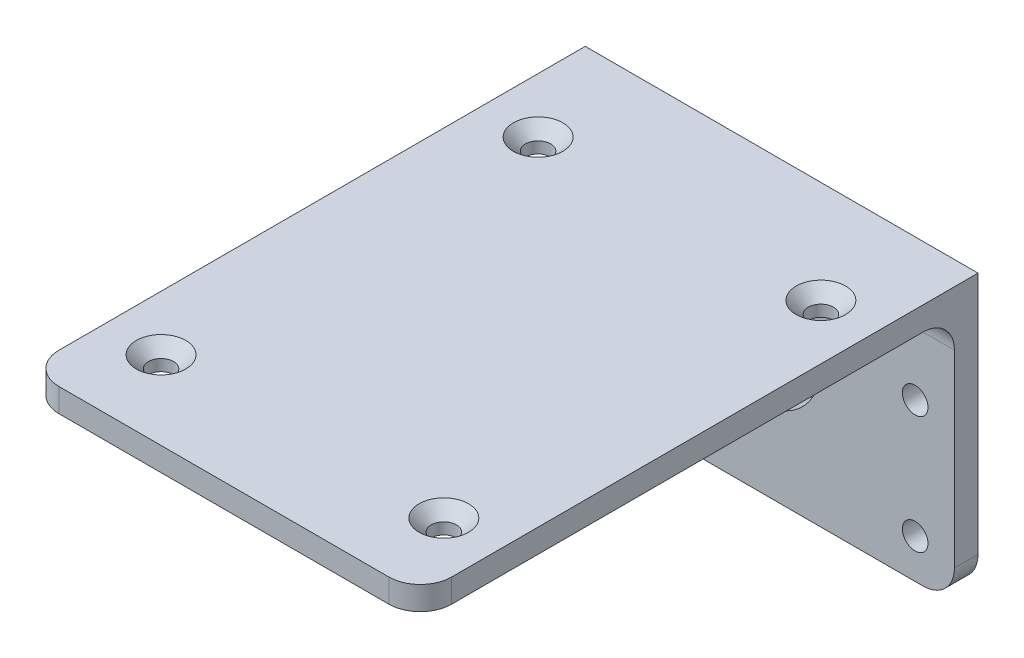
ISO-10303-21;
HEADER;
FILE_DESCRIPTION(('STEP AP214'),'2;1');
FILE_NAME('part.step','',(''),(''),'','','');
FILE_SCHEMA(('AUTOMOTIVE_DESIGN { 1 0 10303 214 1 1 1 1 }'));
ENDSEC;
DATA;
#1=APPLICATION_CONTEXT('core data for automotive mechanical design processes');
#2=APPLICATION_PROTOCOL_DEFINITION('international standard','automotive_design',2000,#1);
#3=PRODUCT_CONTEXT('',#1,'mechanical');
#4=PRODUCT('Part','Part','',(#3));
#5=PRODUCT_RELATED_PRODUCT_CATEGORY('part','',(#4));
#6=PRODUCT_DEFINITION_FORMATION('','',#4);
#7=PRODUCT_DEFINITION_CONTEXT('part definition',#1,'design');
#8=PRODUCT_DEFINITION('design','',#6,#7);
#9=PRODUCT_DEFINITION_SHAPE('','',#8);
#10=(LENGTH_UNIT() NAMED_UNIT(*) SI_UNIT(.MILLI.,.METRE.));
#11=(NAMED_UNIT(*) PLANE_ANGLE_UNIT() SI_UNIT($,.RADIAN.));
#12=(NAMED_UNIT(*) SI_UNIT($,.STERADIAN.) SOLID_ANGLE_UNIT());
#13=UNCERTAINTY_MEASURE_WITH_UNIT(LENGTH_MEASURE(1.E-05),#10,'distance_accuracy_value','');
#14=(GEOMETRIC_REPRESENTATION_CONTEXT(3) GLOBAL_UNCERTAINTY_ASSIGNED_CONTEXT((#13)) GLOBAL_UNIT_ASSIGNED_CONTEXT((#10,
#11,#12)) REPRESENTATION_CONTEXT('',''));
#15=CARTESIAN_POINT('',(0.,0.,0.));
#16=DIRECTION('',(0.,0.,1.));
#17=DIRECTION('',(1.,0.,0.));
#18=AXIS2_PLACEMENT_3D('',#15,#16,#17);
#19=CARTESIAN_POINT('',(0.,0.,153.));
#20=DIRECTION('',(0.,0.,-1.));
#21=DIRECTION('',(-1.,0.,0.));
#22=AXIS2_PLACEMENT_3D('',#19,#20,#21);
#23=PLANE('',#22);
#24=DIRECTION('',(1.,0.,0.));
#25=VECTOR('',#24,1.);
#26=CARTESIAN_POINT('',(-25.0000000000001,25.,153.));
#27=LINE('',#26,#25);
#28=CARTESIAN_POINT('',(-21.0000000000001,25.,153.));
#29=VERTEX_POINT('',#28);
#30=CARTESIAN_POINT('',(21.,25.,153.));
#31=VERTEX_POINT('',#30);
#32=EDGE_CURVE('E159',#29,#31,#27,.T.);
#33=ORIENTED_EDGE('',*,*,#32,.T.);
#34=CARTESIAN_POINT('',(21.,29.,153.));
#35=DIRECTION('',(0.,0.,-1.));
#36=DIRECTION('',(-1.,0.,0.));
#37=AXIS2_PLACEMENT_3D('',#34,#35,#36);
#38=CIRCLE('',#37,4.);
#39=CARTESIAN_POINT('',(25.,29.,153.));
#40=VERTEX_POINT('',#39);
#41=EDGE_CURVE('E177',#31,#40,#38,.F.);
#42=ORIENTED_EDGE('',*,*,#41,.T.);
#43=DIRECTION('',(0.,1.,0.));
#44=VECTOR('',#43,1.);
#45=CARTESIAN_POINT('',(25.,25.,153.));
#46=LINE('',#45,#44);
#47=CARTESIAN_POINT('',(25.,53.,153.));
#48=VERTEX_POINT('',#47);
#49=EDGE_CURVE('E158',#40,#48,#46,.T.);
#50=ORIENTED_EDGE('',*,*,#49,.T.);
#51=DIRECTION('',(-1.,0.,0.));
#52=VECTOR('',#51,1.);
#53=CARTESIAN_POINT('',(0.,53.,153.));
#54=LINE('',#53,#52);
#55=CARTESIAN_POINT('',(-25.0000000000001,53.,153.));
#56=VERTEX_POINT('',#55);
#57=EDGE_CURVE('E172',#48,#56,#54,.T.);
#58=ORIENTED_EDGE('',*,*,#57,.T.);
#59=DIRECTION('',(0.,-1.,0.));
#60=VECTOR('',#59,1.);
#61=CARTESIAN_POINT('',(-25.0000000000001,25.,153.));
#62=LINE('',#61,#60);
#63=CARTESIAN_POINT('',(-25.0000000000001,29.,153.));
#64=VERTEX_POINT('',#63);
#65=EDGE_CURVE('E203',#56,#64,#62,.T.);
#66=ORIENTED_EDGE('',*,*,#65,.T.);
#67=CARTESIAN_POINT('',(-21.0000000000001,29.,153.));
#68=DIRECTION('',(0.,0.,-1.));
#69=DIRECTION('',(-1.,0.,0.));
#70=AXIS2_PLACEMENT_3D('',#67,#68,#69);
#71=CIRCLE('',#70,4.);
#72=EDGE_CURVE('E175',#64,#29,#71,.F.);
#73=ORIENTED_EDGE('',*,*,#72,.T.);
#74=EDGE_LOOP('',(#33,#42,#50,#58,#66,#73));
#75=FACE_BOUND('',#74,.T.);
#76=CARTESIAN_POINT('',(20.,30.,153.));
#77=DIRECTION('',(0.,0.,1.));
#78=DIRECTION('',(1.,0.,0.));
#79=AXIS2_PLACEMENT_3D('',#76,#77,#78);
#80=CIRCLE('',#79,1.635);
#81=CARTESIAN_POINT('',(21.6350000000001,30.,153.));
#82=VERTEX_POINT('',#81);
#83=EDGE_CURVE('E145',#82,#82,#80,.T.);
#84=ORIENTED_EDGE('',*,*,#83,.F.);
#85=EDGE_LOOP('',(#84));
#86=FACE_BOUND('',#85,.T.);
#87=CARTESIAN_POINT('',(20.,45.,153.));
#88=DIRECTION('',(0.,0.,1.));
#89=DIRECTION('',(1.,0.,0.));
#90=AXIS2_PLACEMENT_3D('',#87,#88,#89);
#91=CIRCLE('',#90,1.635);
#92=CARTESIAN_POINT('',(21.635,45.,153.));
#93=VERTEX_POINT('',#92);
#94=EDGE_CURVE('E338',#93,#93,#91,.T.);
#95=ORIENTED_EDGE('',*,*,#94,.F.);
#96=EDGE_LOOP('',(#95));
#97=FACE_BOUND('',#96,.T.);
#98=CARTESIAN_POINT('',(-20.,45.,153.));
#99=DIRECTION('',(0.,0.,1.));
#100=DIRECTION('',(1.,0.,0.));
#101=AXIS2_PLACEMENT_3D('',#98,#99,#100);
#102=CIRCLE('',#101,1.635);
#103=CARTESIAN_POINT('',(-18.365,45.,153.));
#104=VERTEX_POINT('',#103);
#105=EDGE_CURVE('E343',#104,#104,#102,.T.);
#106=ORIENTED_EDGE('',*,*,#105,.F.);
#107=EDGE_LOOP('',(#106));
#108=FACE_BOUND('',#107,.T.);
#109=CARTESIAN_POINT('',(-20.,30.,153.));
#110=DIRECTION('',(0.,0.,1.));
#111=DIRECTION('',(1.,0.,0.));
#112=AXIS2_PLACEMENT_3D('',#109,#110,#111);
#113=CIRCLE('',#112,1.635);
#114=CARTESIAN_POINT('',(-18.365,30.,153.));
#115=VERTEX_POINT('',#114);
#116=EDGE_CURVE('E370',#115,#115,#113,.T.);
#117=ORIENTED_EDGE('',*,*,#116,.F.);
#118=EDGE_LOOP('',(#117));
#119=FACE_BOUND('',#118,.T.);
#120=CARTESIAN_POINT('',(0.,42.75,153.));
#121=DIRECTION('',(0.,0.,1.));
#122=DIRECTION('',(1.,0.,0.));
#123=AXIS2_PLACEMENT_3D('',#120,#121,#122);
#124=CIRCLE('',#123,8.);
#125=CARTESIAN_POINT('',(7.99999999999996,42.75,153.));
#126=VERTEX_POINT('',#125);
#127=EDGE_CURVE('E363',#126,#126,#124,.T.);
#128=ORIENTED_EDGE('',*,*,#127,.F.);
#129=EDGE_LOOP('',(#128));
#130=FACE_BOUND('',#129,.T.);
#131=ADVANCED_FACE('F39',(#75,#86,#97,#108,#119,#130),#23,.F.);
#132=CARTESIAN_POINT('',(0.,0.,150.));
#133=DIRECTION('',(0.,0.,-1.));
#134=DIRECTION('',(-1.,0.,0.));
#135=AXIS2_PLACEMENT_3D('',#132,#133,#134);
#136=PLANE('',#135);
#137=CARTESIAN_POINT('',(-20.,30.,150.));
#138=DIRECTION('',(0.,0.,1.));
#139=DIRECTION('',(1.,0.,0.));
#140=AXIS2_PLACEMENT_3D('',#137,#138,#139);
#141=CIRCLE('',#140,1.635);
#142=CARTESIAN_POINT('',(-18.365,30.,150.));
#143=VERTEX_POINT('',#142);
#144=EDGE_CURVE('E366',#143,#143,#141,.T.);
#145=ORIENTED_EDGE('',*,*,#144,.T.);
#146=EDGE_LOOP('',(#145));
#147=FACE_BOUND('',#146,.T.);
#148=CARTESIAN_POINT('',(20.,45.,150.));
#149=DIRECTION('',(0.,0.,1.));
#150=DIRECTION('',(1.,0.,0.));
#151=AXIS2_PLACEMENT_3D('',#148,#149,#150);
#152=CIRCLE('',#151,1.635);
#153=CARTESIAN_POINT('',(21.635,45.,150.));
#154=VERTEX_POINT('',#153);
#155=EDGE_CURVE('E341',#154,#154,#152,.T.);
#156=ORIENTED_EDGE('',*,*,#155,.T.);
#157=EDGE_LOOP('',(#156));
#158=FACE_BOUND('',#157,.T.);
#159=DIRECTION('',(0.,1.,0.));
#160=VECTOR('',#159,1.);
#161=CARTESIAN_POINT('',(25.,25.,150.));
#162=LINE('',#161,#160);
#163=CARTESIAN_POINT('',(25.,29.,150.));
#164=VERTEX_POINT('',#163);
#165=CARTESIAN_POINT('',(25.,60.,150.));
#166=VERTEX_POINT('',#165);
#167=EDGE_CURVE('E139',#164,#166,#162,.T.);
#168=ORIENTED_EDGE('',*,*,#167,.F.);
#169=CARTESIAN_POINT('',(21.,29.,150.));
#170=DIRECTION('',(0.,0.,-1.));
#171=DIRECTION('',(-1.,0.,0.));
#172=AXIS2_PLACEMENT_3D('',#169,#170,#171);
#173=CIRCLE('',#172,4.);
#174=CARTESIAN_POINT('',(21.,25.,150.));
#175=VERTEX_POINT('',#174);
#176=EDGE_CURVE('E165',#164,#175,#173,.T.);
#177=ORIENTED_EDGE('',*,*,#176,.T.);
#178=DIRECTION('',(1.,0.,0.));
#179=VECTOR('',#178,1.);
#180=CARTESIAN_POINT('',(-25.0000000000001,25.,150.));
#181=LINE('',#180,#179);
#182=CARTESIAN_POINT('',(-21.0000000000001,25.,150.));
#183=VERTEX_POINT('',#182);
#184=EDGE_CURVE('E152',#183,#175,#181,.T.);
#185=ORIENTED_EDGE('',*,*,#184,.F.);
#186=CARTESIAN_POINT('',(-21.0000000000001,29.,150.));
#187=DIRECTION('',(0.,0.,-1.));
#188=DIRECTION('',(-1.,0.,0.));
#189=AXIS2_PLACEMENT_3D('',#186,#187,#188);
#190=CIRCLE('',#189,4.);
#191=CARTESIAN_POINT('',(-25.0000000000001,29.,150.));
#192=VERTEX_POINT('',#191);
#193=EDGE_CURVE('E163',#183,#192,#190,.T.);
#194=ORIENTED_EDGE('',*,*,#193,.T.);
#195=DIRECTION('',(0.,-1.,0.));
#196=VECTOR('',#195,1.);
#197=CARTESIAN_POINT('',(-25.0000000000001,25.,150.));
#198=LINE('',#197,#196);
#199=CARTESIAN_POINT('',(-25.0000000000001,60.,150.));
#200=VERTEX_POINT('',#199);
#201=EDGE_CURVE('E150',#200,#192,#198,.T.);
#202=ORIENTED_EDGE('',*,*,#201,.F.);
#203=DIRECTION('',(-1.,0.,0.));
#204=VECTOR('',#203,1.);
#205=CARTESIAN_POINT('',(-25.0000000000001,60.,150.));
#206=LINE('',#205,#204);
#207=EDGE_CURVE('E128',#166,#200,#206,.T.);
#208=ORIENTED_EDGE('',*,*,#207,.F.);
#209=EDGE_LOOP('',(#168,#177,#185,#194,#202,#208));
#210=FACE_BOUND('',#209,.T.);
#211=CARTESIAN_POINT('',(20.,30.,150.));
#212=DIRECTION('',(0.,0.,1.));
#213=DIRECTION('',(1.,0.,0.));
#214=AXIS2_PLACEMENT_3D('',#211,#212,#213);
#215=CIRCLE('',#214,1.635);
#216=CARTESIAN_POINT('',(21.6350000000001,30.,150.));
#217=VERTEX_POINT('',#216);
#218=EDGE_CURVE('E222',#217,#217,#215,.T.);
#219=ORIENTED_EDGE('',*,*,#218,.T.);
#220=EDGE_LOOP('',(#219));
#221=FACE_BOUND('',#220,.T.);
#222=CARTESIAN_POINT('',(-20.,45.,150.));
#223=DIRECTION('',(0.,0.,1.));
#224=DIRECTION('',(1.,0.,0.));
#225=AXIS2_PLACEMENT_3D('',#222,#223,#224);
#226=CIRCLE('',#225,1.635);
#227=CARTESIAN_POINT('',(-18.365,45.,150.));
#228=VERTEX_POINT('',#227);
#229=EDGE_CURVE('E347',#228,#228,#226,.T.);
#230=ORIENTED_EDGE('',*,*,#229,.T.);
#231=EDGE_LOOP('',(#230));
#232=FACE_BOUND('',#231,.T.);
#233=CARTESIAN_POINT('',(0.,42.75,150.));
#234=DIRECTION('',(0.,0.,1.));
#235=DIRECTION('',(1.,0.,0.));
#236=AXIS2_PLACEMENT_3D('',#233,#234,#235);
#237=CIRCLE('',#236,8.);
#238=CARTESIAN_POINT('',(7.99999999999996,42.75,150.));
#239=VERTEX_POINT('',#238);
#240=EDGE_CURVE('E361',#239,#239,#237,.T.);
#241=ORIENTED_EDGE('',*,*,#240,.T.);
#242=EDGE_LOOP('',(#241));
#243=FACE_BOUND('',#242,.T.);
#244=ADVANCED_FACE('F147',(#147,#158,#210,#221,#232,#243),#136,.T.);
#245=CARTESIAN_POINT('',(25.,25.,153.));
#246=DIRECTION('',(-1.,0.,0.));
#247=DIRECTION('',(0.,0.,1.));
#248=AXIS2_PLACEMENT_3D('',#245,#246,#247);
#249=PLANE('',#248);
#250=ORIENTED_EDGE('',*,*,#49,.F.);
#251=DIRECTION('',(0.,0.,-1.));
#252=VECTOR('',#251,1.);
#253=CARTESIAN_POINT('',(25.,29.,153.));
#254=LINE('',#253,#252);
#255=EDGE_CURVE('E143',#40,#164,#254,.T.);
#256=ORIENTED_EDGE('',*,*,#255,.T.);
#257=ORIENTED_EDGE('',*,*,#167,.T.);
#258=DIRECTION('',(0.,0.,-1.));
#259=VECTOR('',#258,1.);
#260=CARTESIAN_POINT('',(25.,60.,153.));
#261=LINE('',#260,#259);
#262=CARTESIAN_POINT('',(25.,60.,217.));
#263=VERTEX_POINT('',#262);
#264=EDGE_CURVE('E123',#263,#166,#261,.T.);
#265=ORIENTED_EDGE('',*,*,#264,.F.);
#266=DIRECTION('',(0.,1.,0.));
#267=VECTOR('',#266,1.);
#268=CARTESIAN_POINT('',(25.,57.,217.));
#269=LINE('',#268,#267);
#270=CARTESIAN_POINT('',(25.,57.,217.));
#271=VERTEX_POINT('',#270);
#272=EDGE_CURVE('E134',#263,#271,#269,.F.);
#273=ORIENTED_EDGE('',*,*,#272,.T.);
#274=DIRECTION('',(0.,0.,-1.));
#275=VECTOR('',#274,1.);
#276=CARTESIAN_POINT('',(25.,57.,221.));
#277=LINE('',#276,#275);
#278=CARTESIAN_POINT('',(25.,57.,157.));
#279=VERTEX_POINT('',#278);
#280=EDGE_CURVE('E211',#271,#279,#277,.T.);
#281=ORIENTED_EDGE('',*,*,#280,.T.);
#282=CARTESIAN_POINT('',(25.,53.,157.));
#283=DIRECTION('',(-1.,0.,0.));
#284=DIRECTION('',(0.,0.,1.));
#285=AXIS2_PLACEMENT_3D('',#282,#283,#284);
#286=CIRCLE('',#285,4.);
#287=EDGE_CURVE('E11',#279,#48,#286,.T.);
#288=ORIENTED_EDGE('',*,*,#287,.T.);
#289=EDGE_LOOP('',(#250,#256,#257,#265,#273,#281,#288));
#290=FACE_BOUND('',#289,.T.);
#291=ADVANCED_FACE('F141',(#290),#249,.F.);
#292=CARTESIAN_POINT('',(-25.0000000000001,60.,153.));
#293=DIRECTION('',(0.,-1.,0.));
#294=DIRECTION('',(0.,0.,-1.));
#295=AXIS2_PLACEMENT_3D('',#292,#293,#294);
#296=PLANE('',#295);
#297=CARTESIAN_POINT('',(-17.9999999999995,60.,211.000000000001));
#298=DIRECTION('',(0.,1.,0.));
#299=DIRECTION('',(0.,0.,1.));
#300=AXIS2_PLACEMENT_3D('',#297,#298,#299);
#301=CIRCLE('',#300,3.15);
#302=CARTESIAN_POINT('',(-17.9999999999995,60.,214.150000000001));
#303=VERTEX_POINT('',#302);
#304=EDGE_CURVE('E414',#303,#303,#301,.T.);
#305=ORIENTED_EDGE('',*,*,#304,.F.);
#306=EDGE_LOOP('',(#305));
#307=FACE_BOUND('',#306,.T.);
#308=CARTESIAN_POINT('',(18.,60.,211.));
#309=DIRECTION('',(0.,1.,0.));
#310=DIRECTION('',(0.,0.,1.));
#311=AXIS2_PLACEMENT_3D('',#308,#309,#310);
#312=CIRCLE('',#311,3.15);
#313=CARTESIAN_POINT('',(18.,60.,214.15));
#314=VERTEX_POINT('',#313);
#315=EDGE_CURVE('E408',#314,#314,#312,.T.);
#316=ORIENTED_EDGE('',*,*,#315,.F.);
#317=EDGE_LOOP('',(#316));
#318=FACE_BOUND('',#317,.T.);
#319=CARTESIAN_POINT('',(17.9999999999995,60.,163.));
#320=DIRECTION('',(0.,1.,0.));
#321=DIRECTION('',(0.,0.,1.));
#322=AXIS2_PLACEMENT_3D('',#319,#320,#321);
#323=CIRCLE('',#322,3.15);
#324=CARTESIAN_POINT('',(17.9999999999995,60.,166.15));
#325=VERTEX_POINT('',#324);
#326=EDGE_CURVE('E402',#325,#325,#323,.T.);
#327=ORIENTED_EDGE('',*,*,#326,.F.);
#328=EDGE_LOOP('',(#327));
#329=FACE_BOUND('',#328,.T.);
#330=CARTESIAN_POINT('',(-18.,60.,163.));
#331=DIRECTION('',(0.,1.,0.));
#332=DIRECTION('',(0.,0.,1.));
#333=AXIS2_PLACEMENT_3D('',#330,#331,#332);
#334=CIRCLE('',#333,3.15);
#335=CARTESIAN_POINT('',(-18.,60.,166.15));
#336=VERTEX_POINT('',#335);
#337=EDGE_CURVE('E396',#336,#336,#334,.T.);
#338=ORIENTED_EDGE('',*,*,#337,.F.);
#339=EDGE_LOOP('',(#338));
#340=FACE_BOUND('',#339,.T.);
#341=DIRECTION('',(0.,0.,-1.));
#342=VECTOR('',#341,1.);
#343=CARTESIAN_POINT('',(-25.0000000000001,60.,153.));
#344=LINE('',#343,#342);
#345=CARTESIAN_POINT('',(-25.0000000000001,60.,217.));
#346=VERTEX_POINT('',#345);
#347=EDGE_CURVE('E135',#346,#200,#344,.T.);
#348=ORIENTED_EDGE('',*,*,#347,.F.);
#349=CARTESIAN_POINT('',(-21.0000000000001,60.,217.));
#350=DIRECTION('',(0.,-1.,0.));
#351=DIRECTION('',(0.,0.,-1.));
#352=AXIS2_PLACEMENT_3D('',#349,#350,#351);
#353=CIRCLE('',#352,4.);
#354=CARTESIAN_POINT('',(-21.0000000000001,60.,221.));
#355=VERTEX_POINT('',#354);
#356=EDGE_CURVE('E185',#346,#355,#353,.F.);
#357=ORIENTED_EDGE('',*,*,#356,.T.);
#358=DIRECTION('',(1.,0.,0.));
#359=VECTOR('',#358,1.);
#360=CARTESIAN_POINT('',(-25.,60.,221.));
#361=LINE('',#360,#359);
#362=CARTESIAN_POINT('',(21.,60.,221.));
#363=VERTEX_POINT('',#362);
#364=EDGE_CURVE('E236',#355,#363,#361,.T.);
#365=ORIENTED_EDGE('',*,*,#364,.T.);
#366=CARTESIAN_POINT('',(21.,60.,217.));
#367=DIRECTION('',(0.,-1.,0.));
#368=DIRECTION('',(0.,0.,-1.));
#369=AXIS2_PLACEMENT_3D('',#366,#367,#368);
#370=CIRCLE('',#369,4.);
#371=EDGE_CURVE('E131',#363,#263,#370,.F.);
#372=ORIENTED_EDGE('',*,*,#371,.T.);
#373=ORIENTED_EDGE('',*,*,#264,.T.);
#374=ORIENTED_EDGE('',*,*,#207,.T.);
#375=EDGE_LOOP('',(#348,#357,#365,#372,#373,#374));
#376=FACE_BOUND('',#375,.T.);
#377=ADVANCED_FACE('F126',(#307,#318,#329,#340,#376),#296,.F.);
#378=CARTESIAN_POINT('',(-25.0000000000001,25.,153.));
#379=DIRECTION('',(1.,0.,0.));
#380=DIRECTION('',(0.,0.,-1.));
#381=AXIS2_PLACEMENT_3D('',#378,#379,#380);
#382=PLANE('',#381);
#383=ORIENTED_EDGE('',*,*,#201,.T.);
#384=DIRECTION('',(0.,0.,-1.));
#385=VECTOR('',#384,1.);
#386=CARTESIAN_POINT('',(-25.0000000000001,29.,153.));
#387=LINE('',#386,#385);
#388=EDGE_CURVE('E182',#192,#64,#387,.F.);
#389=ORIENTED_EDGE('',*,*,#388,.T.);
#390=ORIENTED_EDGE('',*,*,#65,.F.);
#391=CARTESIAN_POINT('',(-25.0000000000001,53.,157.));
#392=DIRECTION('',(1.,0.,0.));
#393=DIRECTION('',(0.,0.,-1.));
#394=AXIS2_PLACEMENT_3D('',#391,#392,#393);
#395=CIRCLE('',#394,4.);
#396=CARTESIAN_POINT('',(-25.,57.,157.));
#397=VERTEX_POINT('',#396);
#398=EDGE_CURVE('E47',#56,#397,#395,.T.);
#399=ORIENTED_EDGE('',*,*,#398,.T.);
#400=DIRECTION('',(0.,0.,1.));
#401=VECTOR('',#400,1.);
#402=CARTESIAN_POINT('',(-25.,57.,221.));
#403=LINE('',#402,#401);
#404=CARTESIAN_POINT('',(-25.,57.,217.));
#405=VERTEX_POINT('',#404);
#406=EDGE_CURVE('E200',#397,#405,#403,.T.);
#407=ORIENTED_EDGE('',*,*,#406,.T.);
#408=DIRECTION('',(0.,1.,0.));
#409=VECTOR('',#408,1.);
#410=CARTESIAN_POINT('',(-25.0000000000001,60.,217.));
#411=LINE('',#410,#409);
#412=EDGE_CURVE('E179',#405,#346,#411,.T.);
#413=ORIENTED_EDGE('',*,*,#412,.T.);
#414=ORIENTED_EDGE('',*,*,#347,.T.);
#415=EDGE_LOOP('',(#383,#389,#390,#399,#407,#413,#414));
#416=FACE_BOUND('',#415,.T.);
#417=ADVANCED_FACE('F199',(#416),#382,.F.);
#418=CARTESIAN_POINT('',(-25.0000000000001,25.,153.));
#419=DIRECTION('',(0.,1.,0.));
#420=DIRECTION('',(0.,0.,1.));
#421=AXIS2_PLACEMENT_3D('',#418,#419,#420);
#422=PLANE('',#421);
#423=ORIENTED_EDGE('',*,*,#184,.T.);
#424=DIRECTION('',(0.,0.,-1.));
#425=VECTOR('',#424,1.);
#426=CARTESIAN_POINT('',(21.,25.,153.));
#427=LINE('',#426,#425);
#428=EDGE_CURVE('E170',#175,#31,#427,.F.);
#429=ORIENTED_EDGE('',*,*,#428,.T.);
#430=ORIENTED_EDGE('',*,*,#32,.F.);
#431=DIRECTION('',(0.,0.,-1.));
#432=VECTOR('',#431,1.);
#433=CARTESIAN_POINT('',(-21.0000000000001,25.,153.));
#434=LINE('',#433,#432);
#435=EDGE_CURVE('E167',#29,#183,#434,.T.);
#436=ORIENTED_EDGE('',*,*,#435,.T.);
#437=EDGE_LOOP('',(#423,#429,#430,#436));
#438=FACE_BOUND('',#437,.T.);
#439=ADVANCED_FACE('F232',(#438),#422,.F.);
#440=CARTESIAN_POINT('',(20.,30.,153.));
#441=DIRECTION('',(0.,0.,-1.));
#442=DIRECTION('',(-1.,0.,0.));
#443=AXIS2_PLACEMENT_3D('',#440,#441,#442);
#444=CYLINDRICAL_SURFACE('',#443,1.635);
#445=ORIENTED_EDGE('',*,*,#83,.T.);
#446=EDGE_LOOP('',(#445));
#447=FACE_BOUND('',#446,.T.);
#448=ORIENTED_EDGE('',*,*,#218,.F.);
#449=EDGE_LOOP('',(#448));
#450=FACE_BOUND('',#449,.T.);
#451=ADVANCED_FACE('F261',(#447,#450),#444,.F.);
#452=CARTESIAN_POINT('',(20.,45.,153.));
#453=DIRECTION('',(0.,0.,-1.));
#454=DIRECTION('',(-1.,0.,0.));
#455=AXIS2_PLACEMENT_3D('',#452,#453,#454);
#456=CYLINDRICAL_SURFACE('',#455,1.635);
#457=ORIENTED_EDGE('',*,*,#94,.T.);
#458=EDGE_LOOP('',(#457));
#459=FACE_BOUND('',#458,.T.);
#460=ORIENTED_EDGE('',*,*,#155,.F.);
#461=EDGE_LOOP('',(#460));
#462=FACE_BOUND('',#461,.T.);
#463=ADVANCED_FACE('F327',(#459,#462),#456,.F.);
#464=CARTESIAN_POINT('',(-20.,45.,153.));
#465=DIRECTION('',(0.,0.,-1.));
#466=DIRECTION('',(-1.,0.,0.));
#467=AXIS2_PLACEMENT_3D('',#464,#465,#466);
#468=CYLINDRICAL_SURFACE('',#467,1.635);
#469=ORIENTED_EDGE('',*,*,#105,.T.);
#470=EDGE_LOOP('',(#469));
#471=FACE_BOUND('',#470,.T.);
#472=ORIENTED_EDGE('',*,*,#229,.F.);
#473=EDGE_LOOP('',(#472));
#474=FACE_BOUND('',#473,.T.);
#475=ADVANCED_FACE('F324',(#471,#474),#468,.F.);
#476=CARTESIAN_POINT('',(-20.,30.,153.));
#477=DIRECTION('',(0.,0.,-1.));
#478=DIRECTION('',(-1.,0.,0.));
#479=AXIS2_PLACEMENT_3D('',#476,#477,#478);
#480=CYLINDRICAL_SURFACE('',#479,1.635);
#481=ORIENTED_EDGE('',*,*,#116,.T.);
#482=EDGE_LOOP('',(#481));
#483=FACE_BOUND('',#482,.T.);
#484=ORIENTED_EDGE('',*,*,#144,.F.);
#485=EDGE_LOOP('',(#484));
#486=FACE_BOUND('',#485,.T.);
#487=ADVANCED_FACE('F320',(#483,#486),#480,.F.);
#488=CARTESIAN_POINT('',(0.,42.75,153.));
#489=DIRECTION('',(0.,0.,-1.));
#490=DIRECTION('',(-1.,0.,0.));
#491=AXIS2_PLACEMENT_3D('',#488,#489,#490);
#492=CYLINDRICAL_SURFACE('',#491,8.);
#493=ORIENTED_EDGE('',*,*,#127,.T.);
#494=EDGE_LOOP('',(#493));
#495=FACE_BOUND('',#494,.T.);
#496=ORIENTED_EDGE('',*,*,#240,.F.);
#497=EDGE_LOOP('',(#496));
#498=FACE_BOUND('',#497,.T.);
#499=ADVANCED_FACE('F317',(#495,#498),#492,.F.);
#500=CARTESIAN_POINT('',(-25.,57.,221.));
#501=DIRECTION('',(0.,0.,1.));
#502=DIRECTION('',(1.,0.,0.));
#503=AXIS2_PLACEMENT_3D('',#500,#501,#502);
#504=PLANE('',#503);
#505=ORIENTED_EDGE('',*,*,#364,.F.);
#506=DIRECTION('',(0.,1.,0.));
#507=VECTOR('',#506,1.);
#508=CARTESIAN_POINT('',(-21.0000000000001,57.,221.));
#509=LINE('',#508,#507);
#510=CARTESIAN_POINT('',(-21.0000000000001,57.,221.));
#511=VERTEX_POINT('',#510);
#512=EDGE_CURVE('E61',#355,#511,#509,.F.);
#513=ORIENTED_EDGE('',*,*,#512,.T.);
#514=DIRECTION('',(1.,0.,0.));
#515=VECTOR('',#514,1.);
#516=CARTESIAN_POINT('',(-25.,57.,221.));
#517=LINE('',#516,#515);
#518=CARTESIAN_POINT('',(21.,57.,221.));
#519=VERTEX_POINT('',#518);
#520=EDGE_CURVE('E210',#511,#519,#517,.T.);
#521=ORIENTED_EDGE('',*,*,#520,.T.);
#522=DIRECTION('',(0.,1.,0.));
#523=VECTOR('',#522,1.);
#524=CARTESIAN_POINT('',(21.,60.,221.));
#525=LINE('',#524,#523);
#526=EDGE_CURVE('E187',#519,#363,#525,.T.);
#527=ORIENTED_EDGE('',*,*,#526,.T.);
#528=EDGE_LOOP('',(#505,#513,#521,#527));
#529=FACE_BOUND('',#528,.T.);
#530=ADVANCED_FACE('F238',(#529),#504,.T.);
#531=CARTESIAN_POINT('',(0.,57.,0.));
#532=DIRECTION('',(0.,-1.,0.));
#533=DIRECTION('',(0.,0.,-1.));
#534=AXIS2_PLACEMENT_3D('',#531,#532,#533);
#535=PLANE('',#534);
#536=CARTESIAN_POINT('',(-17.9999999999995,57.,211.000000000001));
#537=DIRECTION('',(0.,1.,0.));
#538=DIRECTION('',(0.,0.,1.));
#539=AXIS2_PLACEMENT_3D('',#536,#537,#538);
#540=CIRCLE('',#539,1.6);
#541=CARTESIAN_POINT('',(-17.9999999999995,57.,212.600000000001));
#542=VERTEX_POINT('',#541);
#543=EDGE_CURVE('E390',#542,#542,#540,.T.);
#544=ORIENTED_EDGE('',*,*,#543,.T.);
#545=EDGE_LOOP('',(#544));
#546=FACE_BOUND('',#545,.T.);
#547=CARTESIAN_POINT('',(18.,57.,211.));
#548=DIRECTION('',(0.,1.,0.));
#549=DIRECTION('',(0.,0.,1.));
#550=AXIS2_PLACEMENT_3D('',#547,#548,#549);
#551=CIRCLE('',#550,1.59999999999999);
#552=CARTESIAN_POINT('',(18.,57.,212.6));
#553=VERTEX_POINT('',#552);
#554=EDGE_CURVE('E387',#553,#553,#551,.T.);
#555=ORIENTED_EDGE('',*,*,#554,.T.);
#556=EDGE_LOOP('',(#555));
#557=FACE_BOUND('',#556,.T.);
#558=CARTESIAN_POINT('',(17.9999999999995,57.,163.));
#559=DIRECTION('',(0.,1.,0.));
#560=DIRECTION('',(0.,0.,1.));
#561=AXIS2_PLACEMENT_3D('',#558,#559,#560);
#562=CIRCLE('',#561,1.6);
#563=CARTESIAN_POINT('',(17.9999999999995,57.,164.599999999999));
#564=VERTEX_POINT('',#563);
#565=EDGE_CURVE('E384',#564,#564,#562,.T.);
#566=ORIENTED_EDGE('',*,*,#565,.T.);
#567=EDGE_LOOP('',(#566));
#568=FACE_BOUND('',#567,.T.);
#569=CARTESIAN_POINT('',(-18.,57.,163.));
#570=DIRECTION('',(0.,1.,0.));
#571=DIRECTION('',(0.,0.,1.));
#572=AXIS2_PLACEMENT_3D('',#569,#570,#571);
#573=CIRCLE('',#572,1.6);
#574=CARTESIAN_POINT('',(-18.,57.,164.6));
#575=VERTEX_POINT('',#574);
#576=EDGE_CURVE('E240',#575,#575,#573,.T.);
#577=ORIENTED_EDGE('',*,*,#576,.T.);
#578=EDGE_LOOP('',(#577));
#579=FACE_BOUND('',#578,.T.);
#580=ORIENTED_EDGE('',*,*,#520,.F.);
#581=CARTESIAN_POINT('',(-21.0000000000001,57.,217.));
#582=DIRECTION('',(0.,-1.,0.));
#583=DIRECTION('',(0.,0.,-1.));
#584=AXIS2_PLACEMENT_3D('',#581,#582,#583);
#585=CIRCLE('',#584,4.);
#586=EDGE_CURVE('E194',#511,#405,#585,.T.);
#587=ORIENTED_EDGE('',*,*,#586,.T.);
#588=ORIENTED_EDGE('',*,*,#406,.F.);
#589=DIRECTION('',(-1.,0.,0.));
#590=VECTOR('',#589,1.);
#591=CARTESIAN_POINT('',(0.,57.,157.));
#592=LINE('',#591,#590);
#593=EDGE_CURVE('E191',#397,#279,#592,.F.);
#594=ORIENTED_EDGE('',*,*,#593,.T.);
#595=ORIENTED_EDGE('',*,*,#280,.F.);
#596=CARTESIAN_POINT('',(21.,57.,217.));
#597=DIRECTION('',(0.,-1.,0.));
#598=DIRECTION('',(0.,0.,-1.));
#599=AXIS2_PLACEMENT_3D('',#596,#597,#598);
#600=CIRCLE('',#599,4.);
#601=EDGE_CURVE('E54',#271,#519,#600,.T.);
#602=ORIENTED_EDGE('',*,*,#601,.T.);
#603=EDGE_LOOP('',(#580,#587,#588,#594,#595,#602));
#604=FACE_BOUND('',#603,.T.);
#605=ADVANCED_FACE('F207',(#546,#557,#568,#579,#604),#535,.T.);
#606=CARTESIAN_POINT('',(-18.,57.,163.));
#607=DIRECTION('',(0.,1.,0.));
#608=DIRECTION('',(0.,0.,1.));
#609=AXIS2_PLACEMENT_3D('',#606,#607,#608);
#610=CYLINDRICAL_SURFACE('',#609,1.6);
#611=CARTESIAN_POINT('',(-18.,58.45,163.));
#612=DIRECTION('',(0.,1.,0.));
#613=DIRECTION('',(0.,0.,1.));
#614=AXIS2_PLACEMENT_3D('',#611,#612,#613);
#615=CIRCLE('',#614,1.6);
#616=CARTESIAN_POINT('',(-18.,58.45,164.6));
#617=VERTEX_POINT('',#616);
#618=EDGE_CURVE('E393',#617,#617,#615,.T.);
#619=ORIENTED_EDGE('',*,*,#618,.T.);
#620=EDGE_LOOP('',(#619));
#621=FACE_BOUND('',#620,.T.);
#622=ORIENTED_EDGE('',*,*,#576,.F.);
#623=EDGE_LOOP('',(#622));
#624=FACE_BOUND('',#623,.T.);
#625=ADVANCED_FACE('F308',(#621,#624),#610,.F.);
#626=CARTESIAN_POINT('',(17.9999999999995,57.,163.));
#627=DIRECTION('',(0.,1.,0.));
#628=DIRECTION('',(0.,0.,1.));
#629=AXIS2_PLACEMENT_3D('',#626,#627,#628);
#630=CYLINDRICAL_SURFACE('',#629,1.6);
#631=CARTESIAN_POINT('',(17.9999999999995,58.45,163.));
#632=DIRECTION('',(0.,1.,0.));
#633=DIRECTION('',(0.,0.,1.));
#634=AXIS2_PLACEMENT_3D('',#631,#632,#633);
#635=CIRCLE('',#634,1.6);
#636=CARTESIAN_POINT('',(17.9999999999995,58.45,164.599999999999));
#637=VERTEX_POINT('',#636);
#638=EDGE_CURVE('E399',#637,#637,#635,.T.);
#639=ORIENTED_EDGE('',*,*,#638,.T.);
#640=EDGE_LOOP('',(#639));
#641=FACE_BOUND('',#640,.T.);
#642=ORIENTED_EDGE('',*,*,#565,.F.);
#643=EDGE_LOOP('',(#642));
#644=FACE_BOUND('',#643,.T.);
#645=ADVANCED_FACE('F304',(#641,#644),#630,.F.);
#646=CARTESIAN_POINT('',(18.,57.,211.));
#647=DIRECTION('',(0.,1.,0.));
#648=DIRECTION('',(0.,0.,1.));
#649=AXIS2_PLACEMENT_3D('',#646,#647,#648);
#650=CYLINDRICAL_SURFACE('',#649,1.59999999999999);
#651=CARTESIAN_POINT('',(18.,58.45,211.));
#652=DIRECTION('',(0.,1.,0.));
#653=DIRECTION('',(0.,0.,1.));
#654=AXIS2_PLACEMENT_3D('',#651,#652,#653);
#655=CIRCLE('',#654,1.6);
#656=CARTESIAN_POINT('',(18.,58.45,212.6));
#657=VERTEX_POINT('',#656);
#658=EDGE_CURVE('E405',#657,#657,#655,.T.);
#659=ORIENTED_EDGE('',*,*,#658,.T.);
#660=EDGE_LOOP('',(#659));
#661=FACE_BOUND('',#660,.T.);
#662=ORIENTED_EDGE('',*,*,#554,.F.);
#663=EDGE_LOOP('',(#662));
#664=FACE_BOUND('',#663,.T.);
#665=ADVANCED_FACE('F300',(#661,#664),#650,.F.);
#666=CARTESIAN_POINT('',(-17.9999999999995,57.,211.000000000001));
#667=DIRECTION('',(0.,1.,0.));
#668=DIRECTION('',(0.,0.,1.));
#669=AXIS2_PLACEMENT_3D('',#666,#667,#668);
#670=CYLINDRICAL_SURFACE('',#669,1.6);
#671=CARTESIAN_POINT('',(-17.9999999999995,58.45,211.000000000001));
#672=DIRECTION('',(0.,1.,0.));
#673=DIRECTION('',(0.,0.,1.));
#674=AXIS2_PLACEMENT_3D('',#671,#672,#673);
#675=CIRCLE('',#674,1.6);
#676=CARTESIAN_POINT('',(-17.9999999999995,58.45,212.600000000001));
#677=VERTEX_POINT('',#676);
#678=EDGE_CURVE('E411',#677,#677,#675,.T.);
#679=ORIENTED_EDGE('',*,*,#678,.T.);
#680=EDGE_LOOP('',(#679));
#681=FACE_BOUND('',#680,.T.);
#682=ORIENTED_EDGE('',*,*,#543,.F.);
#683=EDGE_LOOP('',(#682));
#684=FACE_BOUND('',#683,.T.);
#685=ADVANCED_FACE('F296',(#681,#684),#670,.F.);
#686=CARTESIAN_POINT('',(-18.,60.,163.));
#687=DIRECTION('',(0.,1.,0.));
#688=DIRECTION('',(0.,0.,1.));
#689=AXIS2_PLACEMENT_3D('',#686,#687,#688);
#690=CONICAL_SURFACE('',#689,3.15,0.785398163397448);
#691=ORIENTED_EDGE('',*,*,#618,.F.);
#692=EDGE_LOOP('',(#691));
#693=FACE_BOUND('',#692,.T.);
#694=ORIENTED_EDGE('',*,*,#337,.T.);
#695=EDGE_LOOP('',(#694));
#696=FACE_BOUND('',#695,.T.);
#697=ADVANCED_FACE('F292',(#693,#696),#690,.F.);
#698=CARTESIAN_POINT('',(17.9999999999995,60.,163.));
#699=DIRECTION('',(0.,1.,0.));
#700=DIRECTION('',(0.,0.,1.));
#701=AXIS2_PLACEMENT_3D('',#698,#699,#700);
#702=CONICAL_SURFACE('',#701,3.15,0.785398163397448);
#703=ORIENTED_EDGE('',*,*,#638,.F.);
#704=EDGE_LOOP('',(#703));
#705=FACE_BOUND('',#704,.T.);
#706=ORIENTED_EDGE('',*,*,#326,.T.);
#707=EDGE_LOOP('',(#706));
#708=FACE_BOUND('',#707,.T.);
#709=ADVANCED_FACE('F284',(#705,#708),#702,.F.);
#710=CARTESIAN_POINT('',(18.,60.,211.));
#711=DIRECTION('',(0.,1.,0.));
#712=DIRECTION('',(0.,0.,1.));
#713=AXIS2_PLACEMENT_3D('',#710,#711,#712);
#714=CONICAL_SURFACE('',#713,3.15,0.785398163397448);
#715=ORIENTED_EDGE('',*,*,#658,.F.);
#716=EDGE_LOOP('',(#715));
#717=FACE_BOUND('',#716,.T.);
#718=ORIENTED_EDGE('',*,*,#315,.T.);
#719=EDGE_LOOP('',(#718));
#720=FACE_BOUND('',#719,.T.);
#721=ADVANCED_FACE('F278',(#717,#720),#714,.F.);
#722=CARTESIAN_POINT('',(-17.9999999999995,60.,211.000000000001));
#723=DIRECTION('',(0.,1.,0.));
#724=DIRECTION('',(0.,0.,1.));
#725=AXIS2_PLACEMENT_3D('',#722,#723,#724);
#726=CONICAL_SURFACE('',#725,3.15,0.785398163397448);
#727=ORIENTED_EDGE('',*,*,#678,.F.);
#728=EDGE_LOOP('',(#727));
#729=FACE_BOUND('',#728,.T.);
#730=ORIENTED_EDGE('',*,*,#304,.T.);
#731=EDGE_LOOP('',(#730));
#732=FACE_BOUND('',#731,.T.);
#733=ADVANCED_FACE('F274',(#729,#732),#726,.F.);
#734=CARTESIAN_POINT('',(21.,29.,153.));
#735=DIRECTION('',(0.,0.,-1.));
#736=DIRECTION('',(-1.,0.,0.));
#737=AXIS2_PLACEMENT_3D('',#734,#735,#736);
#738=CYLINDRICAL_SURFACE('',#737,4.);
#739=ORIENTED_EDGE('',*,*,#41,.F.);
#740=ORIENTED_EDGE('',*,*,#428,.F.);
#741=ORIENTED_EDGE('',*,*,#176,.F.);
#742=ORIENTED_EDGE('',*,*,#255,.F.);
#743=EDGE_LOOP('',(#739,#740,#741,#742));
#744=FACE_BOUND('',#743,.T.);
#745=ADVANCED_FACE('F230',(#744),#738,.T.);
#746=CARTESIAN_POINT('',(-21.0000000000001,29.,153.));
#747=DIRECTION('',(0.,0.,-1.));
#748=DIRECTION('',(-1.,0.,0.));
#749=AXIS2_PLACEMENT_3D('',#746,#747,#748);
#750=CYLINDRICAL_SURFACE('',#749,4.);
#751=ORIENTED_EDGE('',*,*,#72,.F.);
#752=ORIENTED_EDGE('',*,*,#388,.F.);
#753=ORIENTED_EDGE('',*,*,#193,.F.);
#754=ORIENTED_EDGE('',*,*,#435,.F.);
#755=EDGE_LOOP('',(#751,#752,#753,#754));
#756=FACE_BOUND('',#755,.T.);
#757=ADVANCED_FACE('F234',(#756),#750,.T.);
#758=CARTESIAN_POINT('',(-21.0000000000001,25.,217.));
#759=DIRECTION('',(0.,-1.,0.));
#760=DIRECTION('',(0.,0.,-1.));
#761=AXIS2_PLACEMENT_3D('',#758,#759,#760);
#762=CYLINDRICAL_SURFACE('',#761,4.);
#763=ORIENTED_EDGE('',*,*,#586,.F.);
#764=ORIENTED_EDGE('',*,*,#512,.F.);
#765=ORIENTED_EDGE('',*,*,#356,.F.);
#766=ORIENTED_EDGE('',*,*,#412,.F.);
#767=EDGE_LOOP('',(#763,#764,#765,#766));
#768=FACE_BOUND('',#767,.T.);
#769=ADVANCED_FACE('F242',(#768),#762,.T.);
#770=CARTESIAN_POINT('',(21.,57.,217.));
#771=DIRECTION('',(0.,-1.,0.));
#772=DIRECTION('',(0.,0.,-1.));
#773=AXIS2_PLACEMENT_3D('',#770,#771,#772);
#774=CYLINDRICAL_SURFACE('',#773,4.);
#775=ORIENTED_EDGE('',*,*,#601,.F.);
#776=ORIENTED_EDGE('',*,*,#272,.F.);
#777=ORIENTED_EDGE('',*,*,#371,.F.);
#778=ORIENTED_EDGE('',*,*,#526,.F.);
#779=EDGE_LOOP('',(#775,#776,#777,#778));
#780=FACE_BOUND('',#779,.T.);
#781=ADVANCED_FACE('F244',(#780),#774,.T.);
#782=CARTESIAN_POINT('',(0.,53.,157.));
#783=DIRECTION('',(-1.,0.,0.));
#784=DIRECTION('',(0.,0.,1.));
#785=AXIS2_PLACEMENT_3D('',#782,#783,#784);
#786=CYLINDRICAL_SURFACE('',#785,4.);
#787=ORIENTED_EDGE('',*,*,#287,.F.);
#788=ORIENTED_EDGE('',*,*,#593,.F.);
#789=ORIENTED_EDGE('',*,*,#398,.F.);
#790=ORIENTED_EDGE('',*,*,#57,.F.);
#791=EDGE_LOOP('',(#787,#788,#789,#790));
#792=FACE_BOUND('',#791,.T.);
#793=ADVANCED_FACE('F41',(#792),#786,.F.);
#794=CLOSED_SHELL('',(#131,#244,#291,#377,#417,#439,#451,#463,#475,#487,#499,#530,#605,#625,
#645,#665,#685,#697,#709,#721,#733,#745,#757,#769,#781,#793));
#795=MANIFOLD_SOLID_BREP('B2',#794);
#796=ADVANCED_BREP_SHAPE_REPRESENTATION('',(#18,#795),#14);
#797=SHAPE_DEFINITION_REPRESENTATION(#9,#796);
ENDSEC;
END-ISO-10303-21;
